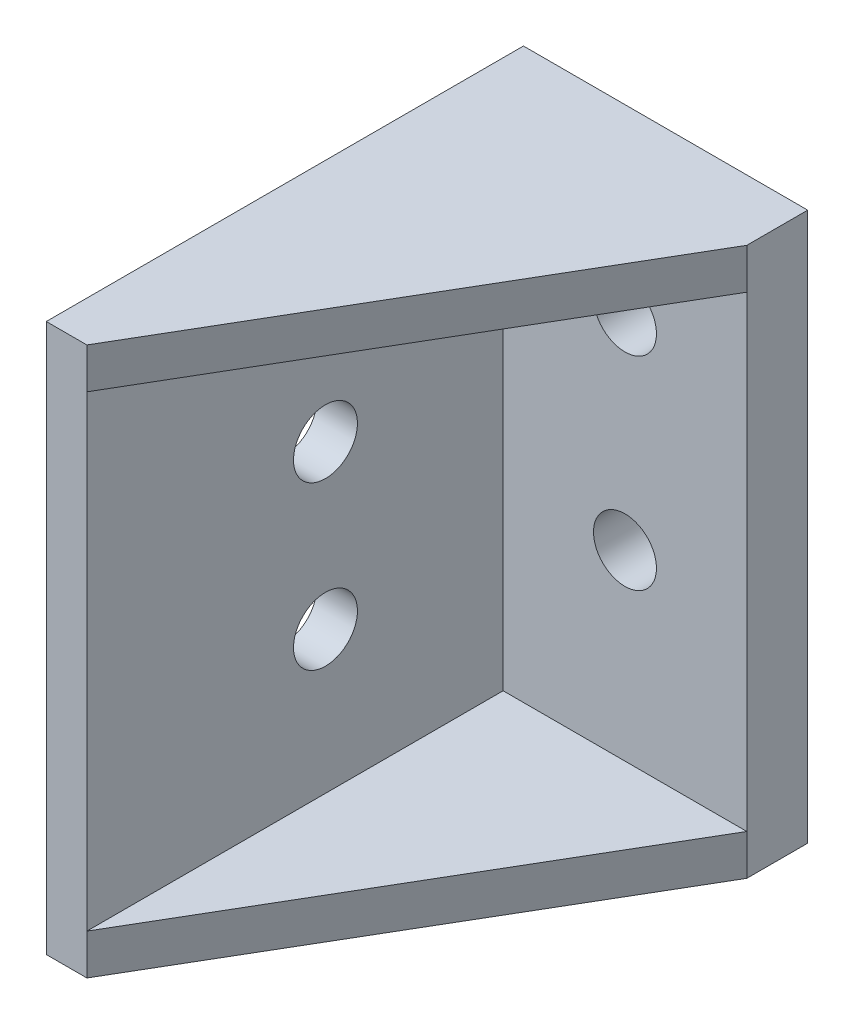
ISO-10303-21;
HEADER;
FILE_DESCRIPTION(('STEP AP214'),'2;1');
FILE_NAME('part.step','',(''),(''),'','','');
FILE_SCHEMA(('AUTOMOTIVE_DESIGN { 1 0 10303 214 1 1 1 1 }'));
ENDSEC;
DATA;
#1=APPLICATION_CONTEXT('core data for automotive mechanical design processes');
#2=APPLICATION_PROTOCOL_DEFINITION('international standard','automotive_design',2000,#1);
#3=PRODUCT_CONTEXT('',#1,'mechanical');
#4=PRODUCT('Part','Part','',(#3));
#5=PRODUCT_RELATED_PRODUCT_CATEGORY('part','',(#4));
#6=PRODUCT_DEFINITION_FORMATION('','',#4);
#7=PRODUCT_DEFINITION_CONTEXT('part definition',#1,'design');
#8=PRODUCT_DEFINITION('design','',#6,#7);
#9=PRODUCT_DEFINITION_SHAPE('','',#8);
#10=(LENGTH_UNIT() NAMED_UNIT(*) SI_UNIT(.MILLI.,.METRE.));
#11=(NAMED_UNIT(*) PLANE_ANGLE_UNIT() SI_UNIT($,.RADIAN.));
#12=(NAMED_UNIT(*) SI_UNIT($,.STERADIAN.) SOLID_ANGLE_UNIT());
#13=UNCERTAINTY_MEASURE_WITH_UNIT(LENGTH_MEASURE(1.E-05),#10,'distance_accuracy_value','');
#14=(GEOMETRIC_REPRESENTATION_CONTEXT(3) GLOBAL_UNCERTAINTY_ASSIGNED_CONTEXT((#13)) GLOBAL_UNIT_ASSIGNED_CONTEXT((#10,
#11,#12)) REPRESENTATION_CONTEXT('',''));
#15=CARTESIAN_POINT('',(0.,0.,0.));
#16=DIRECTION('',(0.,0.,1.));
#17=DIRECTION('',(1.,0.,0.));
#18=AXIS2_PLACEMENT_3D('',#15,#16,#17);
#19=CARTESIAN_POINT('',(0.,0.,3.));
#20=DIRECTION('',(0.,0.,-1.));
#21=DIRECTION('',(-1.,0.,0.));
#22=AXIS2_PLACEMENT_3D('',#19,#20,#21);
#23=PLANE('',#22);
#24=CARTESIAN_POINT('',(8.,9.,3.));
#25=DIRECTION('',(0.,0.,1.));
#26=DIRECTION('',(1.,0.,0.));
#27=AXIS2_PLACEMENT_3D('',#24,#25,#26);
#28=CIRCLE('',#27,1.55);
#29=CARTESIAN_POINT('',(9.55,9.,3.));
#30=VERTEX_POINT('',#29);
#31=EDGE_CURVE('E195',#30,#30,#28,.T.);
#32=ORIENTED_EDGE('',*,*,#31,.F.);
#33=EDGE_LOOP('',(#32));
#34=FACE_BOUND('',#33,.T.);
#35=CARTESIAN_POINT('',(8.,19.,3.));
#36=DIRECTION('',(0.,0.,1.));
#37=DIRECTION('',(1.,0.,0.));
#38=AXIS2_PLACEMENT_3D('',#35,#36,#37);
#39=CIRCLE('',#38,1.55);
#40=CARTESIAN_POINT('',(9.55,19.,3.));
#41=VERTEX_POINT('',#40);
#42=EDGE_CURVE('E208',#41,#41,#39,.T.);
#43=ORIENTED_EDGE('',*,*,#42,.F.);
#44=EDGE_LOOP('',(#43));
#45=FACE_BOUND('',#44,.T.);
#46=DIRECTION('',(1.,0.,0.));
#47=VECTOR('',#46,1.);
#48=CARTESIAN_POINT('',(14.,23.,3.));
#49=LINE('',#48,#47);
#50=CARTESIAN_POINT('',(2.,23.,3.));
#51=VERTEX_POINT('',#50);
#52=CARTESIAN_POINT('',(14.,23.,3.));
#53=VERTEX_POINT('',#52);
#54=EDGE_CURVE('E155',#51,#53,#49,.T.);
#55=ORIENTED_EDGE('',*,*,#54,.F.);
#56=DIRECTION('',(0.,1.,0.));
#57=VECTOR('',#56,1.);
#58=CARTESIAN_POINT('',(2.,23.,3.));
#59=LINE('',#58,#57);
#60=CARTESIAN_POINT('',(2.,0.,3.));
#61=VERTEX_POINT('',#60);
#62=EDGE_CURVE('E167',#61,#51,#59,.T.);
#63=ORIENTED_EDGE('',*,*,#62,.F.);
#64=DIRECTION('',(1.,0.,0.));
#65=VECTOR('',#64,1.);
#66=CARTESIAN_POINT('',(0.,0.,3.));
#67=LINE('',#66,#65);
#68=CARTESIAN_POINT('',(14.,0.,3.));
#69=VERTEX_POINT('',#68);
#70=EDGE_CURVE('E57',#61,#69,#67,.T.);
#71=ORIENTED_EDGE('',*,*,#70,.T.);
#72=DIRECTION('',(0.,1.,0.));
#73=VECTOR('',#72,1.);
#74=CARTESIAN_POINT('',(14.,0.,3.));
#75=LINE('',#74,#73);
#76=EDGE_CURVE('E182',#69,#53,#75,.T.);
#77=ORIENTED_EDGE('',*,*,#76,.T.);
#78=EDGE_LOOP('',(#55,#63,#71,#77));
#79=FACE_BOUND('',#78,.T.);
#80=ADVANCED_FACE('F33',(#34,#45,#79),#23,.F.);
#81=CARTESIAN_POINT('',(0.,0.,0.));
#82=DIRECTION('',(0.,0.,-1.));
#83=DIRECTION('',(-1.,0.,0.));
#84=AXIS2_PLACEMENT_3D('',#81,#82,#83);
#85=PLANE('',#84);
#86=CARTESIAN_POINT('',(8.,19.,0.));
#87=DIRECTION('',(0.,0.,1.));
#88=DIRECTION('',(1.,0.,0.));
#89=AXIS2_PLACEMENT_3D('',#86,#87,#88);
#90=CIRCLE('',#89,1.55);
#91=CARTESIAN_POINT('',(9.55,19.,0.));
#92=VERTEX_POINT('',#91);
#93=EDGE_CURVE('E394',#92,#92,#90,.T.);
#94=ORIENTED_EDGE('',*,*,#93,.T.);
#95=EDGE_LOOP('',(#94));
#96=FACE_BOUND('',#95,.T.);
#97=DIRECTION('',(0.,-1.,0.));
#98=VECTOR('',#97,1.);
#99=CARTESIAN_POINT('',(0.,0.,0.));
#100=LINE('',#99,#98);
#101=CARTESIAN_POINT('',(0.,25.,0.));
#102=VERTEX_POINT('',#101);
#103=CARTESIAN_POINT('',(0.,-2.,0.));
#104=VERTEX_POINT('',#103);
#105=EDGE_CURVE('E111',#102,#104,#100,.T.);
#106=ORIENTED_EDGE('',*,*,#105,.F.);
#107=DIRECTION('',(-1.,0.,0.));
#108=VECTOR('',#107,1.);
#109=CARTESIAN_POINT('',(0.,25.,0.));
#110=LINE('',#109,#108);
#111=CARTESIAN_POINT('',(14.,25.,0.));
#112=VERTEX_POINT('',#111);
#113=EDGE_CURVE('E108',#112,#102,#110,.T.);
#114=ORIENTED_EDGE('',*,*,#113,.F.);
#115=DIRECTION('',(0.,1.,0.));
#116=VECTOR('',#115,1.);
#117=CARTESIAN_POINT('',(14.,0.,0.));
#118=LINE('',#117,#116);
#119=CARTESIAN_POINT('',(14.,-2.,0.));
#120=VERTEX_POINT('',#119);
#121=EDGE_CURVE('E101',#120,#112,#118,.T.);
#122=ORIENTED_EDGE('',*,*,#121,.F.);
#123=DIRECTION('',(1.,0.,0.));
#124=VECTOR('',#123,1.);
#125=CARTESIAN_POINT('',(0.,-2.,0.));
#126=LINE('',#125,#124);
#127=EDGE_CURVE('E107',#104,#120,#126,.T.);
#128=ORIENTED_EDGE('',*,*,#127,.F.);
#129=EDGE_LOOP('',(#106,#114,#122,#128));
#130=FACE_BOUND('',#129,.T.);
#131=CARTESIAN_POINT('',(8.,9.,0.));
#132=DIRECTION('',(0.,0.,1.));
#133=DIRECTION('',(1.,0.,0.));
#134=AXIS2_PLACEMENT_3D('',#131,#132,#133);
#135=CIRCLE('',#134,1.55);
#136=CARTESIAN_POINT('',(9.55,9.,0.));
#137=VERTEX_POINT('',#136);
#138=EDGE_CURVE('E193',#137,#137,#135,.T.);
#139=ORIENTED_EDGE('',*,*,#138,.T.);
#140=EDGE_LOOP('',(#139));
#141=FACE_BOUND('',#140,.T.);
#142=ADVANCED_FACE('F104',(#96,#130,#141),#85,.T.);
#143=CARTESIAN_POINT('',(0.,0.,3.));
#144=DIRECTION('',(1.,0.,0.));
#145=DIRECTION('',(0.,1.,0.));
#146=AXIS2_PLACEMENT_3D('',#143,#144,#145);
#147=PLANE('',#146);
#148=CARTESIAN_POINT('',(0.,7.,11.75));
#149=DIRECTION('',(-1.,0.,0.));
#150=DIRECTION('',(0.,-1.,0.));
#151=AXIS2_PLACEMENT_3D('',#148,#149,#150);
#152=CIRCLE('',#151,1.575);
#153=CARTESIAN_POINT('',(0.,5.425,11.75));
#154=VERTEX_POINT('',#153);
#155=EDGE_CURVE('E142',#154,#154,#152,.T.);
#156=ORIENTED_EDGE('',*,*,#155,.F.);
#157=EDGE_LOOP('',(#156));
#158=FACE_BOUND('',#157,.T.);
#159=CARTESIAN_POINT('',(0.,15.,11.75));
#160=DIRECTION('',(-1.,0.,0.));
#161=DIRECTION('',(0.,-1.,0.));
#162=AXIS2_PLACEMENT_3D('',#159,#160,#161);
#163=CIRCLE('',#162,1.575);
#164=CARTESIAN_POINT('',(0.,13.425,11.75));
#165=VERTEX_POINT('',#164);
#166=EDGE_CURVE('E147',#165,#165,#163,.T.);
#167=ORIENTED_EDGE('',*,*,#166,.F.);
#168=EDGE_LOOP('',(#167));
#169=FACE_BOUND('',#168,.T.);
#170=ORIENTED_EDGE('',*,*,#105,.T.);
#171=DIRECTION('',(0.,0.,-1.));
#172=VECTOR('',#171,1.);
#173=CARTESIAN_POINT('',(0.,-2.,23.5));
#174=LINE('',#173,#172);
#175=CARTESIAN_POINT('',(0.,-2.,23.5));
#176=VERTEX_POINT('',#175);
#177=EDGE_CURVE('E126',#176,#104,#174,.T.);
#178=ORIENTED_EDGE('',*,*,#177,.F.);
#179=DIRECTION('',(0.,-1.,0.));
#180=VECTOR('',#179,1.);
#181=CARTESIAN_POINT('',(0.,0.,23.5));
#182=LINE('',#181,#180);
#183=CARTESIAN_POINT('',(0.,25.,23.5));
#184=VERTEX_POINT('',#183);
#185=EDGE_CURVE('E157',#184,#176,#182,.T.);
#186=ORIENTED_EDGE('',*,*,#185,.F.);
#187=DIRECTION('',(0.,0.,-1.));
#188=VECTOR('',#187,1.);
#189=CARTESIAN_POINT('',(0.,25.,3.));
#190=LINE('',#189,#188);
#191=EDGE_CURVE('E185',#184,#102,#190,.T.);
#192=ORIENTED_EDGE('',*,*,#191,.T.);
#193=EDGE_LOOP('',(#170,#178,#186,#192));
#194=FACE_BOUND('',#193,.T.);
#195=ADVANCED_FACE('F35',(#158,#169,#194),#147,.F.);
#196=CARTESIAN_POINT('',(14.,0.,3.));
#197=DIRECTION('',(-1.,0.,0.));
#198=DIRECTION('',(0.,-1.,0.));
#199=AXIS2_PLACEMENT_3D('',#196,#197,#198);
#200=PLANE('',#199);
#201=DIRECTION('',(0.,0.,-1.));
#202=VECTOR('',#201,1.);
#203=CARTESIAN_POINT('',(14.,25.,3.));
#204=LINE('',#203,#202);
#205=CARTESIAN_POINT('',(14.,25.,3.));
#206=VERTEX_POINT('',#205);
#207=EDGE_CURVE('E42',#206,#112,#204,.T.);
#208=ORIENTED_EDGE('',*,*,#207,.F.);
#209=DIRECTION('',(0.,-1.,0.));
#210=VECTOR('',#209,1.);
#211=CARTESIAN_POINT('',(14.,43.5,3.));
#212=LINE('',#211,#210);
#213=EDGE_CURVE('E143',#206,#53,#212,.T.);
#214=ORIENTED_EDGE('',*,*,#213,.T.);
#215=ORIENTED_EDGE('',*,*,#76,.F.);
#216=DIRECTION('',(0.,1.,0.));
#217=VECTOR('',#216,1.);
#218=CARTESIAN_POINT('',(14.,-2.,3.));
#219=LINE('',#218,#217);
#220=CARTESIAN_POINT('',(14.,-2.,3.));
#221=VERTEX_POINT('',#220);
#222=EDGE_CURVE('E117',#221,#69,#219,.T.);
#223=ORIENTED_EDGE('',*,*,#222,.F.);
#224=DIRECTION('',(0.,0.,1.));
#225=VECTOR('',#224,1.);
#226=CARTESIAN_POINT('',(14.,-2.,0.));
#227=LINE('',#226,#225);
#228=EDGE_CURVE('E114',#120,#221,#227,.T.);
#229=ORIENTED_EDGE('',*,*,#228,.F.);
#230=ORIENTED_EDGE('',*,*,#121,.T.);
#231=EDGE_LOOP('',(#208,#214,#215,#223,#229,#230));
#232=FACE_BOUND('',#231,.T.);
#233=ADVANCED_FACE('F115',(#232),#200,.F.);
#234=CARTESIAN_POINT('',(0.,25.,3.));
#235=DIRECTION('',(0.,-1.,0.));
#236=DIRECTION('',(0.,0.,-1.));
#237=AXIS2_PLACEMENT_3D('',#234,#235,#236);
#238=PLANE('',#237);
#239=DIRECTION('',(-1.,0.,0.));
#240=VECTOR('',#239,1.);
#241=CARTESIAN_POINT('',(0.,25.,23.5));
#242=LINE('',#241,#240);
#243=CARTESIAN_POINT('',(2.,25.,23.5));
#244=VERTEX_POINT('',#243);
#245=EDGE_CURVE('E154',#244,#184,#242,.T.);
#246=ORIENTED_EDGE('',*,*,#245,.F.);
#247=DIRECTION('',(0.505179201568937,0.,-0.863014469346935));
#248=VECTOR('',#247,1.);
#249=CARTESIAN_POINT('',(10.4271156402304,25.,9.10367744793974));
#250=LINE('',#249,#248);
#251=EDGE_CURVE('E50',#244,#206,#250,.T.);
#252=ORIENTED_EDGE('',*,*,#251,.T.);
#253=ORIENTED_EDGE('',*,*,#207,.T.);
#254=ORIENTED_EDGE('',*,*,#113,.T.);
#255=ORIENTED_EDGE('',*,*,#191,.F.);
#256=EDGE_LOOP('',(#246,#252,#253,#254,#255));
#257=FACE_BOUND('',#256,.T.);
#258=ADVANCED_FACE('F214',(#257),#238,.F.);
#259=CARTESIAN_POINT('',(8.,19.,3.));
#260=DIRECTION('',(0.,0.,-1.));
#261=DIRECTION('',(-1.,0.,0.));
#262=AXIS2_PLACEMENT_3D('',#259,#260,#261);
#263=CYLINDRICAL_SURFACE('',#262,1.55);
#264=ORIENTED_EDGE('',*,*,#42,.T.);
#265=EDGE_LOOP('',(#264));
#266=FACE_BOUND('',#265,.T.);
#267=ORIENTED_EDGE('',*,*,#93,.F.);
#268=EDGE_LOOP('',(#267));
#269=FACE_BOUND('',#268,.T.);
#270=ADVANCED_FACE('F233',(#266,#269),#263,.F.);
#271=CARTESIAN_POINT('',(8.,9.,3.));
#272=DIRECTION('',(0.,0.,-1.));
#273=DIRECTION('',(-1.,0.,0.));
#274=AXIS2_PLACEMENT_3D('',#271,#272,#273);
#275=CYLINDRICAL_SURFACE('',#274,1.55);
#276=ORIENTED_EDGE('',*,*,#31,.T.);
#277=EDGE_LOOP('',(#276));
#278=FACE_BOUND('',#277,.T.);
#279=ORIENTED_EDGE('',*,*,#138,.F.);
#280=EDGE_LOOP('',(#279));
#281=FACE_BOUND('',#280,.T.);
#282=ADVANCED_FACE('F223',(#278,#281),#275,.F.);
#283=CARTESIAN_POINT('',(2.,23.,23.5));
#284=DIRECTION('',(-1.,0.,0.));
#285=DIRECTION('',(0.,-1.,0.));
#286=AXIS2_PLACEMENT_3D('',#283,#284,#285);
#287=PLANE('',#286);
#288=CARTESIAN_POINT('',(2.,7.,11.75));
#289=DIRECTION('',(-1.,0.,0.));
#290=DIRECTION('',(0.,-1.,0.));
#291=AXIS2_PLACEMENT_3D('',#288,#289,#290);
#292=CIRCLE('',#291,1.575);
#293=CARTESIAN_POINT('',(2.,5.425,11.75));
#294=VERTEX_POINT('',#293);
#295=EDGE_CURVE('E146',#294,#294,#292,.T.);
#296=ORIENTED_EDGE('',*,*,#295,.T.);
#297=EDGE_LOOP('',(#296));
#298=FACE_BOUND('',#297,.T.);
#299=CARTESIAN_POINT('',(2.,15.,11.75));
#300=DIRECTION('',(-1.,0.,0.));
#301=DIRECTION('',(0.,-1.,0.));
#302=AXIS2_PLACEMENT_3D('',#299,#300,#301);
#303=CIRCLE('',#302,1.575);
#304=CARTESIAN_POINT('',(2.,13.425,11.75));
#305=VERTEX_POINT('',#304);
#306=EDGE_CURVE('E150',#305,#305,#303,.T.);
#307=ORIENTED_EDGE('',*,*,#306,.T.);
#308=EDGE_LOOP('',(#307));
#309=FACE_BOUND('',#308,.T.);
#310=ORIENTED_EDGE('',*,*,#62,.T.);
#311=DIRECTION('',(0.,0.,-1.));
#312=VECTOR('',#311,1.);
#313=CARTESIAN_POINT('',(2.,23.,23.5));
#314=LINE('',#313,#312);
#315=CARTESIAN_POINT('',(2.,23.,23.5));
#316=VERTEX_POINT('',#315);
#317=EDGE_CURVE('E159',#316,#51,#314,.T.);
#318=ORIENTED_EDGE('',*,*,#317,.F.);
#319=DIRECTION('',(0.,1.,0.));
#320=VECTOR('',#319,1.);
#321=CARTESIAN_POINT('',(2.,23.,23.5));
#322=LINE('',#321,#320);
#323=CARTESIAN_POINT('',(2.,0.,23.5));
#324=VERTEX_POINT('',#323);
#325=EDGE_CURVE('E151',#324,#316,#322,.T.);
#326=ORIENTED_EDGE('',*,*,#325,.F.);
#327=DIRECTION('',(0.,0.,-1.));
#328=VECTOR('',#327,1.);
#329=CARTESIAN_POINT('',(2.,0.,23.5));
#330=LINE('',#329,#328);
#331=EDGE_CURVE('E191',#324,#61,#330,.T.);
#332=ORIENTED_EDGE('',*,*,#331,.T.);
#333=EDGE_LOOP('',(#310,#318,#326,#332));
#334=FACE_BOUND('',#333,.T.);
#335=ADVANCED_FACE('F221',(#298,#309,#334),#287,.F.);
#336=CARTESIAN_POINT('',(14.,23.,23.5));
#337=DIRECTION('',(0.,1.,0.));
#338=DIRECTION('',(0.,0.,1.));
#339=AXIS2_PLACEMENT_3D('',#336,#337,#338);
#340=PLANE('',#339);
#341=ORIENTED_EDGE('',*,*,#54,.T.);
#342=DIRECTION('',(0.505179201568937,0.,-0.863014469346935));
#343=VECTOR('',#342,1.);
#344=CARTESIAN_POINT('',(14.,23.,3.));
#345=LINE('',#344,#343);
#346=EDGE_CURVE('E140',#316,#53,#345,.T.);
#347=ORIENTED_EDGE('',*,*,#346,.F.);
#348=ORIENTED_EDGE('',*,*,#317,.T.);
#349=EDGE_LOOP('',(#341,#347,#348));
#350=FACE_BOUND('',#349,.T.);
#351=ADVANCED_FACE('F187',(#350),#340,.F.);
#352=CARTESIAN_POINT('',(0.,0.,23.5));
#353=DIRECTION('',(0.,0.,-1.));
#354=DIRECTION('',(-1.,0.,0.));
#355=AXIS2_PLACEMENT_3D('',#352,#353,#354);
#356=PLANE('',#355);
#357=ORIENTED_EDGE('',*,*,#325,.T.);
#358=DIRECTION('',(0.,1.,0.));
#359=VECTOR('',#358,1.);
#360=CARTESIAN_POINT('',(2.,0.,23.5));
#361=LINE('',#360,#359);
#362=EDGE_CURVE('E11',#316,#244,#361,.T.);
#363=ORIENTED_EDGE('',*,*,#362,.T.);
#364=ORIENTED_EDGE('',*,*,#245,.T.);
#365=ORIENTED_EDGE('',*,*,#185,.T.);
#366=DIRECTION('',(-1.,0.,0.));
#367=VECTOR('',#366,1.);
#368=CARTESIAN_POINT('',(2.,-2.,23.5));
#369=LINE('',#368,#367);
#370=CARTESIAN_POINT('',(2.,-2.,23.5));
#371=VERTEX_POINT('',#370);
#372=EDGE_CURVE('E133',#371,#176,#369,.T.);
#373=ORIENTED_EDGE('',*,*,#372,.F.);
#374=DIRECTION('',(0.,1.,0.));
#375=VECTOR('',#374,1.);
#376=CARTESIAN_POINT('',(2.,-2.,23.5));
#377=LINE('',#376,#375);
#378=EDGE_CURVE('E135',#371,#324,#377,.T.);
#379=ORIENTED_EDGE('',*,*,#378,.T.);
#380=EDGE_LOOP('',(#357,#363,#364,#365,#373,#379));
#381=FACE_BOUND('',#380,.T.);
#382=ADVANCED_FACE('F218',(#381),#356,.F.);
#383=CARTESIAN_POINT('',(14.00005,15.,11.75));
#384=DIRECTION('',(-1.,0.,0.));
#385=DIRECTION('',(0.,-1.,0.));
#386=AXIS2_PLACEMENT_3D('',#383,#384,#385);
#387=CYLINDRICAL_SURFACE('',#386,1.575);
#388=CARTESIAN_POINT('',(0.,13.425,11.75));
#389=CARTESIAN_POINT('',(0.0208333333333316,13.425,11.75));
#390=CARTESIAN_POINT('',(0.041666666666665,13.425,11.75));
#391=CARTESIAN_POINT('',(0.0833333333333317,13.425,11.75));
#392=CARTESIAN_POINT('',(0.104166666666665,13.425,11.75));
#393=CARTESIAN_POINT('',(0.145833333333332,13.425,11.75));
#394=CARTESIAN_POINT('',(0.166666666666665,13.425,11.75));
#395=CARTESIAN_POINT('',(0.208333333333332,13.425,11.75));
#396=CARTESIAN_POINT('',(0.229166666666665,13.425,11.75));
#397=CARTESIAN_POINT('',(0.270833333333332,13.425,11.75));
#398=CARTESIAN_POINT('',(0.291666666666665,13.425,11.75));
#399=CARTESIAN_POINT('',(0.333333333333332,13.425,11.75));
#400=CARTESIAN_POINT('',(0.354166666666665,13.425,11.75));
#401=CARTESIAN_POINT('',(0.395833333333332,13.425,11.75));
#402=CARTESIAN_POINT('',(0.416666666666665,13.425,11.75));
#403=CARTESIAN_POINT('',(0.458333333333332,13.425,11.75));
#404=CARTESIAN_POINT('',(0.479166666666665,13.425,11.75));
#405=CARTESIAN_POINT('',(0.520833333333332,13.425,11.75));
#406=CARTESIAN_POINT('',(0.541666666666665,13.425,11.75));
#407=CARTESIAN_POINT('',(0.583333333333332,13.425,11.75));
#408=CARTESIAN_POINT('',(0.604166666666666,13.425,11.75));
#409=CARTESIAN_POINT('',(0.645833333333332,13.425,11.75));
#410=CARTESIAN_POINT('',(0.666666666666666,13.425,11.75));
#411=CARTESIAN_POINT('',(0.708333333333332,13.425,11.75));
#412=CARTESIAN_POINT('',(0.729166666666666,13.425,11.75));
#413=CARTESIAN_POINT('',(0.770833333333332,13.425,11.75));
#414=CARTESIAN_POINT('',(0.791666666666666,13.425,11.75));
#415=CARTESIAN_POINT('',(0.833333333333332,13.425,11.75));
#416=CARTESIAN_POINT('',(0.854166666666666,13.425,11.75));
#417=CARTESIAN_POINT('',(0.895833333333332,13.425,11.75));
#418=CARTESIAN_POINT('',(0.916666666666666,13.425,11.75));
#419=CARTESIAN_POINT('',(0.958333333333332,13.425,11.75));
#420=CARTESIAN_POINT('',(0.979166666666666,13.425,11.75));
#421=CARTESIAN_POINT('',(1.02083333333333,13.425,11.75));
#422=CARTESIAN_POINT('',(1.04166666666667,13.425,11.75));
#423=CARTESIAN_POINT('',(1.08333333333333,13.425,11.75));
#424=CARTESIAN_POINT('',(1.10416666666667,13.425,11.75));
#425=CARTESIAN_POINT('',(1.14583333333333,13.425,11.75));
#426=CARTESIAN_POINT('',(1.16666666666667,13.425,11.75));
#427=CARTESIAN_POINT('',(1.20833333333333,13.425,11.75));
#428=CARTESIAN_POINT('',(1.22916666666667,13.425,11.75));
#429=CARTESIAN_POINT('',(1.27083333333333,13.425,11.75));
#430=CARTESIAN_POINT('',(1.29166666666667,13.425,11.75));
#431=CARTESIAN_POINT('',(1.33333333333333,13.425,11.75));
#432=CARTESIAN_POINT('',(1.35416666666667,13.425,11.75));
#433=CARTESIAN_POINT('',(1.39583333333333,13.425,11.75));
#434=CARTESIAN_POINT('',(1.41666666666667,13.425,11.75));
#435=CARTESIAN_POINT('',(1.45833333333333,13.425,11.75));
#436=CARTESIAN_POINT('',(1.47916666666667,13.425,11.75));
#437=CARTESIAN_POINT('',(1.52083333333333,13.425,11.75));
#438=CARTESIAN_POINT('',(1.54166666666667,13.425,11.75));
#439=CARTESIAN_POINT('',(1.58333333333333,13.425,11.75));
#440=CARTESIAN_POINT('',(1.60416666666667,13.425,11.75));
#441=CARTESIAN_POINT('',(1.64583333333333,13.425,11.75));
#442=CARTESIAN_POINT('',(1.66666666666667,13.425,11.75));
#443=CARTESIAN_POINT('',(1.70833333333333,13.425,11.75));
#444=CARTESIAN_POINT('',(1.72916666666667,13.425,11.75));
#445=CARTESIAN_POINT('',(1.77083333333333,13.425,11.75));
#446=CARTESIAN_POINT('',(1.79166666666667,13.425,11.75));
#447=CARTESIAN_POINT('',(1.83333333333333,13.425,11.75));
#448=CARTESIAN_POINT('',(1.85416666666667,13.425,11.75));
#449=CARTESIAN_POINT('',(1.89583333333333,13.425,11.75));
#450=CARTESIAN_POINT('',(1.91666666666667,13.425,11.75));
#451=CARTESIAN_POINT('',(1.95833333333333,13.425,11.75));
#452=CARTESIAN_POINT('',(1.97916666666667,13.425,11.75));
#453=CARTESIAN_POINT('',(2.,13.425,11.75));
#454=B_SPLINE_CURVE_WITH_KNOTS('',3,(#388,#389,#390,#391,#392,#393,#394,#395,#396,#397,#398,
#399,#400,#401,#402,#403,#404,#405,#406,#407,#408,#409,#410,#411,#412,#413,#414,#415,#416,#417,
#418,#419,#420,#421,#422,#423,#424,#425,#426,#427,#428,#429,#430,#431,#432,#433,#434,#435,#436,
#437,#438,#439,#440,#441,#442,#443,#444,#445,#446,#447,#448,#449,#450,#451,#452,#453),
.UNSPECIFIED.,.F.,.F.,(4,2,2,2,2,2,2,2,2,2,2,2,2,2,2,2,2,2,2,2,2,2,2,2,2,2,2,2,2,2,2,2,4),(0.,
0.0625000000000001,0.125,0.1875,0.25,0.3125,0.375,0.4375,0.5,0.5625,0.625000000000001,
0.687500000000001,0.750000000000001,0.812500000000001,0.875000000000001,0.937500000000001,1.,
1.0625,1.125,1.1875,1.25,1.3125,1.375,1.4375,1.5,1.5625,1.625,1.6875,1.75,1.8125,1.875,1.9375,
2.),.UNSPECIFIED.);
#455=EDGE_CURVE('BSEAM264',#165,#305,#454,.T.);
#456=ORIENTED_EDGE('',*,*,#166,.T.);
#457=ORIENTED_EDGE('',*,*,#306,.F.);
#458=ORIENTED_EDGE('',*,*,#455,.T.);
#459=ORIENTED_EDGE('',*,*,#455,.F.);
#460=EDGE_LOOP('',(#456,#458,#457,#459));
#461=FACE_BOUND('',#460,.T.);
#462=ADVANCED_FACE('F264',(#461),#387,.F.);
#463=CARTESIAN_POINT('',(14.00005,7.,11.75));
#464=DIRECTION('',(-1.,0.,0.));
#465=DIRECTION('',(0.,-1.,0.));
#466=AXIS2_PLACEMENT_3D('',#463,#464,#465);
#467=CYLINDRICAL_SURFACE('',#466,1.575);
#468=CARTESIAN_POINT('',(0.,5.425,11.75));
#469=CARTESIAN_POINT('',(0.0208333333333316,5.425,11.75));
#470=CARTESIAN_POINT('',(0.041666666666665,5.425,11.75));
#471=CARTESIAN_POINT('',(0.0833333333333317,5.425,11.75));
#472=CARTESIAN_POINT('',(0.104166666666665,5.425,11.75));
#473=CARTESIAN_POINT('',(0.145833333333332,5.425,11.75));
#474=CARTESIAN_POINT('',(0.166666666666665,5.425,11.75));
#475=CARTESIAN_POINT('',(0.208333333333332,5.425,11.75));
#476=CARTESIAN_POINT('',(0.229166666666665,5.425,11.75));
#477=CARTESIAN_POINT('',(0.270833333333332,5.425,11.75));
#478=CARTESIAN_POINT('',(0.291666666666665,5.425,11.75));
#479=CARTESIAN_POINT('',(0.333333333333332,5.425,11.75));
#480=CARTESIAN_POINT('',(0.354166666666665,5.425,11.75));
#481=CARTESIAN_POINT('',(0.395833333333332,5.425,11.75));
#482=CARTESIAN_POINT('',(0.416666666666665,5.425,11.75));
#483=CARTESIAN_POINT('',(0.458333333333332,5.425,11.75));
#484=CARTESIAN_POINT('',(0.479166666666665,5.425,11.75));
#485=CARTESIAN_POINT('',(0.520833333333332,5.425,11.75));
#486=CARTESIAN_POINT('',(0.541666666666665,5.425,11.75));
#487=CARTESIAN_POINT('',(0.583333333333332,5.425,11.75));
#488=CARTESIAN_POINT('',(0.604166666666666,5.425,11.75));
#489=CARTESIAN_POINT('',(0.645833333333332,5.425,11.75));
#490=CARTESIAN_POINT('',(0.666666666666666,5.425,11.75));
#491=CARTESIAN_POINT('',(0.708333333333332,5.425,11.75));
#492=CARTESIAN_POINT('',(0.729166666666666,5.425,11.75));
#493=CARTESIAN_POINT('',(0.770833333333332,5.425,11.75));
#494=CARTESIAN_POINT('',(0.791666666666666,5.425,11.75));
#495=CARTESIAN_POINT('',(0.833333333333332,5.425,11.75));
#496=CARTESIAN_POINT('',(0.854166666666666,5.425,11.75));
#497=CARTESIAN_POINT('',(0.895833333333332,5.425,11.75));
#498=CARTESIAN_POINT('',(0.916666666666666,5.425,11.75));
#499=CARTESIAN_POINT('',(0.958333333333332,5.425,11.75));
#500=CARTESIAN_POINT('',(0.979166666666666,5.425,11.75));
#501=CARTESIAN_POINT('',(1.02083333333333,5.425,11.75));
#502=CARTESIAN_POINT('',(1.04166666666667,5.425,11.75));
#503=CARTESIAN_POINT('',(1.08333333333333,5.425,11.75));
#504=CARTESIAN_POINT('',(1.10416666666667,5.425,11.75));
#505=CARTESIAN_POINT('',(1.14583333333333,5.425,11.75));
#506=CARTESIAN_POINT('',(1.16666666666667,5.425,11.75));
#507=CARTESIAN_POINT('',(1.20833333333333,5.425,11.75));
#508=CARTESIAN_POINT('',(1.22916666666667,5.425,11.75));
#509=CARTESIAN_POINT('',(1.27083333333333,5.425,11.75));
#510=CARTESIAN_POINT('',(1.29166666666667,5.425,11.75));
#511=CARTESIAN_POINT('',(1.33333333333333,5.425,11.75));
#512=CARTESIAN_POINT('',(1.35416666666667,5.425,11.75));
#513=CARTESIAN_POINT('',(1.39583333333333,5.425,11.75));
#514=CARTESIAN_POINT('',(1.41666666666667,5.425,11.75));
#515=CARTESIAN_POINT('',(1.45833333333333,5.425,11.75));
#516=CARTESIAN_POINT('',(1.47916666666667,5.425,11.75));
#517=CARTESIAN_POINT('',(1.52083333333333,5.425,11.75));
#518=CARTESIAN_POINT('',(1.54166666666667,5.425,11.75));
#519=CARTESIAN_POINT('',(1.58333333333333,5.425,11.75));
#520=CARTESIAN_POINT('',(1.60416666666667,5.425,11.75));
#521=CARTESIAN_POINT('',(1.64583333333333,5.425,11.75));
#522=CARTESIAN_POINT('',(1.66666666666667,5.425,11.75));
#523=CARTESIAN_POINT('',(1.70833333333333,5.425,11.75));
#524=CARTESIAN_POINT('',(1.72916666666667,5.425,11.75));
#525=CARTESIAN_POINT('',(1.77083333333333,5.425,11.75));
#526=CARTESIAN_POINT('',(1.79166666666667,5.425,11.75));
#527=CARTESIAN_POINT('',(1.83333333333333,5.425,11.75));
#528=CARTESIAN_POINT('',(1.85416666666667,5.425,11.75));
#529=CARTESIAN_POINT('',(1.89583333333333,5.425,11.75));
#530=CARTESIAN_POINT('',(1.91666666666667,5.425,11.75));
#531=CARTESIAN_POINT('',(1.95833333333333,5.425,11.75));
#532=CARTESIAN_POINT('',(1.97916666666667,5.425,11.75));
#533=CARTESIAN_POINT('',(2.,5.425,11.75));
#534=B_SPLINE_CURVE_WITH_KNOTS('',3,(#468,#469,#470,#471,#472,#473,#474,#475,#476,#477,#478,
#479,#480,#481,#482,#483,#484,#485,#486,#487,#488,#489,#490,#491,#492,#493,#494,#495,#496,#497,
#498,#499,#500,#501,#502,#503,#504,#505,#506,#507,#508,#509,#510,#511,#512,#513,#514,#515,#516,
#517,#518,#519,#520,#521,#522,#523,#524,#525,#526,#527,#528,#529,#530,#531,#532,#533),
.UNSPECIFIED.,.F.,.F.,(4,2,2,2,2,2,2,2,2,2,2,2,2,2,2,2,2,2,2,2,2,2,2,2,2,2,2,2,2,2,2,2,4),(0.,
0.0625000000000001,0.125,0.1875,0.25,0.3125,0.375,0.4375,0.5,0.5625,0.625000000000001,
0.687500000000001,0.750000000000001,0.812500000000001,0.875000000000001,0.937500000000001,1.,
1.0625,1.125,1.1875,1.25,1.3125,1.375,1.4375,1.5,1.5625,1.625,1.6875,1.75,1.8125,1.875,1.9375,
2.),.UNSPECIFIED.);
#535=EDGE_CURVE('BSEAM267',#154,#294,#534,.T.);
#536=ORIENTED_EDGE('',*,*,#155,.T.);
#537=ORIENTED_EDGE('',*,*,#295,.F.);
#538=ORIENTED_EDGE('',*,*,#535,.T.);
#539=ORIENTED_EDGE('',*,*,#535,.F.);
#540=EDGE_LOOP('',(#536,#538,#537,#539));
#541=FACE_BOUND('',#540,.T.);
#542=ADVANCED_FACE('F267',(#541),#467,.F.);
#543=CARTESIAN_POINT('',(14.,43.5,3.));
#544=DIRECTION('',(-0.863014469346935,0.,-0.505179201568937));
#545=DIRECTION('',(-0.505179201568937,0.,0.863014469346935));
#546=AXIS2_PLACEMENT_3D('',#543,#544,#545);
#547=PLANE('',#546);
#548=ORIENTED_EDGE('',*,*,#362,.F.);
#549=ORIENTED_EDGE('',*,*,#346,.T.);
#550=ORIENTED_EDGE('',*,*,#213,.F.);
#551=ORIENTED_EDGE('',*,*,#251,.F.);
#552=EDGE_LOOP('',(#548,#549,#550,#551));
#553=FACE_BOUND('',#552,.T.);
#554=ADVANCED_FACE('F178',(#553),#547,.F.);
#555=CARTESIAN_POINT('',(14.,-2.,3.));
#556=DIRECTION('',(-0.863014469346935,0.,-0.505179201568937));
#557=DIRECTION('',(-0.505179201568937,0.,0.863014469346935));
#558=AXIS2_PLACEMENT_3D('',#555,#556,#557);
#559=PLANE('',#558);
#560=DIRECTION('',(-0.505179201568937,0.,0.863014469346935));
#561=VECTOR('',#560,1.);
#562=CARTESIAN_POINT('',(14.,0.,3.));
#563=LINE('',#562,#561);
#564=EDGE_CURVE('E127',#69,#324,#563,.T.);
#565=ORIENTED_EDGE('',*,*,#564,.T.);
#566=ORIENTED_EDGE('',*,*,#378,.F.);
#567=DIRECTION('',(-0.505179201568937,0.,0.863014469346935));
#568=VECTOR('',#567,1.);
#569=CARTESIAN_POINT('',(14.,-2.,3.));
#570=LINE('',#569,#568);
#571=EDGE_CURVE('E120',#221,#371,#570,.T.);
#572=ORIENTED_EDGE('',*,*,#571,.F.);
#573=ORIENTED_EDGE('',*,*,#222,.T.);
#574=EDGE_LOOP('',(#565,#566,#572,#573));
#575=FACE_BOUND('',#574,.T.);
#576=ADVANCED_FACE('F279',(#575),#559,.F.);
#577=CARTESIAN_POINT('',(0.,-2.,0.));
#578=DIRECTION('',(0.,-1.,0.));
#579=DIRECTION('',(0.,0.,-1.));
#580=AXIS2_PLACEMENT_3D('',#577,#578,#579);
#581=PLANE('',#580);
#582=ORIENTED_EDGE('',*,*,#127,.T.);
#583=ORIENTED_EDGE('',*,*,#228,.T.);
#584=ORIENTED_EDGE('',*,*,#571,.T.);
#585=ORIENTED_EDGE('',*,*,#372,.T.);
#586=ORIENTED_EDGE('',*,*,#177,.T.);
#587=EDGE_LOOP('',(#582,#583,#584,#585,#586));
#588=FACE_BOUND('',#587,.T.);
#589=ADVANCED_FACE('F123',(#588),#581,.T.);
#590=CARTESIAN_POINT('',(0.,0.,0.));
#591=DIRECTION('',(0.,-1.,0.));
#592=DIRECTION('',(0.,0.,-1.));
#593=AXIS2_PLACEMENT_3D('',#590,#591,#592);
#594=PLANE('',#593);
#595=ORIENTED_EDGE('',*,*,#70,.F.);
#596=ORIENTED_EDGE('',*,*,#331,.F.);
#597=ORIENTED_EDGE('',*,*,#564,.F.);
#598=EDGE_LOOP('',(#595,#596,#597));
#599=FACE_BOUND('',#598,.T.);
#600=ADVANCED_FACE('F283',(#599),#594,.F.);
#601=CLOSED_SHELL('',(#80,#142,#195,#233,#258,#270,#282,#335,#351,#382,#462,#542,#554,#576,#589,#600));
#602=MANIFOLD_SOLID_BREP('B2',#601);
#603=ADVANCED_BREP_SHAPE_REPRESENTATION('',(#18,#602),#14);
#604=SHAPE_DEFINITION_REPRESENTATION(#9,#603);
ENDSEC;
END-ISO-10303-21;
